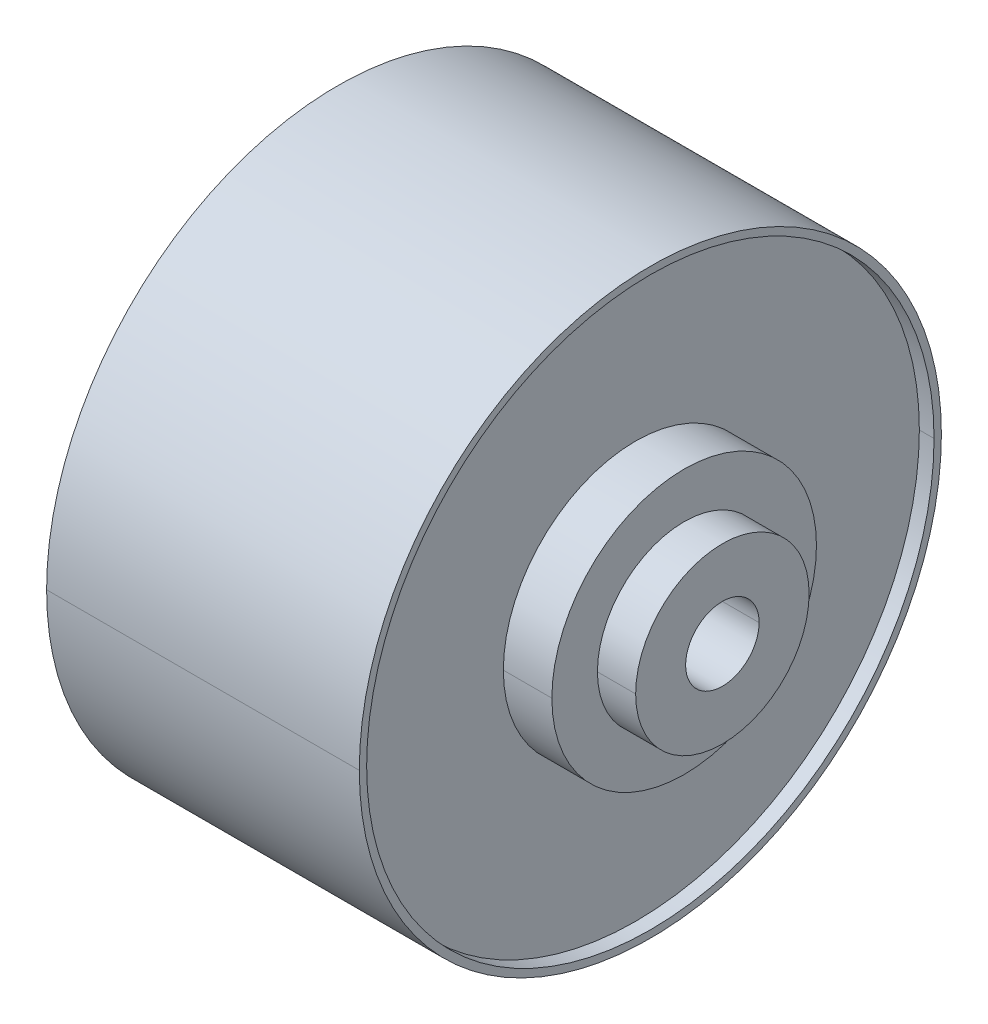
ISO-10303-21;
HEADER;
FILE_DESCRIPTION(('STEP AP214'),'2;1');
FILE_NAME('part.step','',(''),(''),'','','');
FILE_SCHEMA(('AUTOMOTIVE_DESIGN { 1 0 10303 214 1 1 1 1 }'));
ENDSEC;
DATA;
#1=APPLICATION_CONTEXT('core data for automotive mechanical design processes');
#2=APPLICATION_PROTOCOL_DEFINITION('international standard','automotive_design',2000,#1);
#3=PRODUCT_CONTEXT('',#1,'mechanical');
#4=PRODUCT('Part','Part','',(#3));
#5=PRODUCT_RELATED_PRODUCT_CATEGORY('part','',(#4));
#6=PRODUCT_DEFINITION_FORMATION('','',#4);
#7=PRODUCT_DEFINITION_CONTEXT('part definition',#1,'design');
#8=PRODUCT_DEFINITION('design','',#6,#7);
#9=PRODUCT_DEFINITION_SHAPE('','',#8);
#10=(LENGTH_UNIT() NAMED_UNIT(*) SI_UNIT(.MILLI.,.METRE.));
#11=(NAMED_UNIT(*) PLANE_ANGLE_UNIT() SI_UNIT($,.RADIAN.));
#12=(NAMED_UNIT(*) SI_UNIT($,.STERADIAN.) SOLID_ANGLE_UNIT());
#13=UNCERTAINTY_MEASURE_WITH_UNIT(LENGTH_MEASURE(1.E-05),#10,'distance_accuracy_value','');
#14=(GEOMETRIC_REPRESENTATION_CONTEXT(3) GLOBAL_UNCERTAINTY_ASSIGNED_CONTEXT((#13)) GLOBAL_UNIT_ASSIGNED_CONTEXT((#10,
#11,#12)) REPRESENTATION_CONTEXT('',''));
#15=CARTESIAN_POINT('',(0.,0.,0.));
#16=DIRECTION('',(0.,0.,1.));
#17=DIRECTION('',(1.,0.,0.));
#18=AXIS2_PLACEMENT_3D('',#15,#16,#17);
#19=CARTESIAN_POINT('',(2.5,5.9,0.));
#20=DIRECTION('',(-1.,0.,0.));
#21=DIRECTION('',(0.,0.,1.));
#22=AXIS2_PLACEMENT_3D('',#19,#20,#21);
#23=PLANE('',#22);
#24=CARTESIAN_POINT('',(2.5,1.04744440165294E-13,10.));
#25=DIRECTION('',(-1.,0.,0.));
#26=DIRECTION('',(0.,0.,1.));
#27=AXIS2_PLACEMENT_3D('',#24,#25,#26);
#28=CIRCLE('',#27,1.25);
#29=CARTESIAN_POINT('',(2.5,1.04744440165294E-13,11.25));
#30=VERTEX_POINT('',#29);
#31=CARTESIAN_POINT('',(2.5,1.04897521015187E-13,8.75));
#32=VERTEX_POINT('',#31);
#33=EDGE_CURVE('E258',#30,#32,#28,.T.);
#34=ORIENTED_EDGE('',*,*,#33,.T.);
#35=CARTESIAN_POINT('',(2.5,1.04744440165294E-13,10.));
#36=DIRECTION('',(-1.,0.,0.));
#37=DIRECTION('',(0.,0.,1.));
#38=AXIS2_PLACEMENT_3D('',#35,#36,#37);
#39=CIRCLE('',#38,1.25);
#40=EDGE_CURVE('E264',#32,#30,#39,.T.);
#41=ORIENTED_EDGE('',*,*,#40,.T.);
#42=EDGE_LOOP('',(#34,#41));
#43=FACE_BOUND('',#42,.T.);
#44=ADVANCED_FACE('F16',(#43),#23,.T.);
#45=CARTESIAN_POINT('',(0.,0.,0.));
#46=DIRECTION('',(1.,0.,0.));
#47=DIRECTION('',(0.,0.,-1.));
#48=AXIS2_PLACEMENT_3D('',#45,#46,#47);
#49=CYLINDRICAL_SURFACE('',#48,2.5);
#50=DIRECTION('',(1.,0.,0.));
#51=VECTOR('',#50,1.);
#52=CARTESIAN_POINT('',(0.,0.,2.5));
#53=LINE('',#52,#51);
#54=CARTESIAN_POINT('',(21.4,0.,2.5));
#55=VERTEX_POINT('',#54);
#56=CARTESIAN_POINT('',(26.9,0.,2.5));
#57=VERTEX_POINT('',#56);
#58=EDGE_CURVE('E246',#55,#57,#53,.T.);
#59=ORIENTED_EDGE('',*,*,#58,.F.);
#60=CARTESIAN_POINT('',(21.4,0.,0.));
#61=DIRECTION('',(1.,0.,0.));
#62=DIRECTION('',(0.,0.,-1.));
#63=AXIS2_PLACEMENT_3D('',#60,#61,#62);
#64=CIRCLE('',#63,2.5);
#65=CARTESIAN_POINT('',(21.4,0.,-2.5));
#66=VERTEX_POINT('',#65);
#67=EDGE_CURVE('E336',#66,#55,#64,.T.);
#68=ORIENTED_EDGE('',*,*,#67,.F.);
#69=DIRECTION('',(1.,0.,0.));
#70=VECTOR('',#69,1.);
#71=CARTESIAN_POINT('',(0.,0.,-2.5));
#72=LINE('',#71,#70);
#73=CARTESIAN_POINT('',(26.9,0.,-2.5));
#74=VERTEX_POINT('',#73);
#75=EDGE_CURVE('E270',#66,#74,#72,.T.);
#76=ORIENTED_EDGE('',*,*,#75,.T.);
#77=CARTESIAN_POINT('',(26.9,0.,0.));
#78=DIRECTION('',(1.,0.,0.));
#79=DIRECTION('',(0.,0.,-1.));
#80=AXIS2_PLACEMENT_3D('',#77,#78,#79);
#81=CIRCLE('',#80,2.5);
#82=EDGE_CURVE('E11',#74,#57,#81,.T.);
#83=ORIENTED_EDGE('',*,*,#82,.T.);
#84=EDGE_LOOP('',(#59,#68,#76,#83));
#85=FACE_BOUND('',#84,.T.);
#86=ADVANCED_FACE('F500',(#85),#49,.F.);
#87=CARTESIAN_POINT('',(26.9,2.5,0.));
#88=DIRECTION('',(1.,0.,0.));
#89=DIRECTION('',(0.,1.,0.));
#90=AXIS2_PLACEMENT_3D('',#87,#88,#89);
#91=PLANE('',#90);
#92=ORIENTED_EDGE('',*,*,#82,.F.);
#93=CARTESIAN_POINT('',(26.9,0.,0.));
#94=DIRECTION('',(1.,0.,0.));
#95=DIRECTION('',(0.,0.,-1.));
#96=AXIS2_PLACEMENT_3D('',#93,#94,#95);
#97=CIRCLE('',#96,2.5);
#98=EDGE_CURVE('E250',#57,#74,#97,.T.);
#99=ORIENTED_EDGE('',*,*,#98,.F.);
#100=EDGE_LOOP('',(#92,#99));
#101=FACE_BOUND('',#100,.T.);
#102=CARTESIAN_POINT('',(26.9,0.,0.));
#103=DIRECTION('',(1.,0.,0.));
#104=DIRECTION('',(0.,0.,-1.));
#105=AXIS2_PLACEMENT_3D('',#102,#103,#104);
#106=CIRCLE('',#105,5.9);
#107=CARTESIAN_POINT('',(26.9,0.,5.9));
#108=VERTEX_POINT('',#107);
#109=CARTESIAN_POINT('',(26.9,0.,-5.9));
#110=VERTEX_POINT('',#109);
#111=EDGE_CURVE('E27',#108,#110,#106,.T.);
#112=ORIENTED_EDGE('',*,*,#111,.T.);
#113=CARTESIAN_POINT('',(26.9,0.,0.));
#114=DIRECTION('',(1.,0.,0.));
#115=DIRECTION('',(0.,0.,-1.));
#116=AXIS2_PLACEMENT_3D('',#113,#114,#115);
#117=CIRCLE('',#116,5.9);
#118=EDGE_CURVE('E265',#110,#108,#117,.T.);
#119=ORIENTED_EDGE('',*,*,#118,.T.);
#120=EDGE_LOOP('',(#112,#119));
#121=FACE_BOUND('',#120,.T.);
#122=ADVANCED_FACE('F505',(#101,#121),#91,.T.);
#123=CARTESIAN_POINT('',(-70.3323251128322,0.,0.));
#124=DIRECTION('',(-1.,0.,0.));
#125=DIRECTION('',(0.,0.,1.));
#126=AXIS2_PLACEMENT_3D('',#123,#124,#125);
#127=CYLINDRICAL_SURFACE('',#126,5.9);
#128=DIRECTION('',(-1.,0.,0.));
#129=VECTOR('',#128,1.);
#130=CARTESIAN_POINT('',(-70.3323251128322,0.,-5.9));
#131=LINE('',#130,#129);
#132=CARTESIAN_POINT('',(24.3,0.,-5.9));
#133=VERTEX_POINT('',#132);
#134=EDGE_CURVE('E269',#110,#133,#131,.T.);
#135=ORIENTED_EDGE('',*,*,#134,.F.);
#136=ORIENTED_EDGE('',*,*,#111,.F.);
#137=DIRECTION('',(-1.,0.,0.));
#138=VECTOR('',#137,1.);
#139=CARTESIAN_POINT('',(-70.3323251128322,0.,5.9));
#140=LINE('',#139,#138);
#141=CARTESIAN_POINT('',(24.3,0.,5.9));
#142=VERTEX_POINT('',#141);
#143=EDGE_CURVE('E325',#108,#142,#140,.T.);
#144=ORIENTED_EDGE('',*,*,#143,.T.);
#145=CARTESIAN_POINT('',(24.3,0.,0.));
#146=DIRECTION('',(1.,0.,0.));
#147=DIRECTION('',(0.,0.,-1.));
#148=AXIS2_PLACEMENT_3D('',#145,#146,#147);
#149=CIRCLE('',#148,5.9);
#150=EDGE_CURVE('E280',#142,#133,#149,.T.);
#151=ORIENTED_EDGE('',*,*,#150,.T.);
#152=EDGE_LOOP('',(#135,#136,#144,#151));
#153=FACE_BOUND('',#152,.T.);
#154=ADVANCED_FACE('F509',(#153),#127,.T.);
#155=CARTESIAN_POINT('',(2.5,5.9,0.));
#156=DIRECTION('',(-1.,0.,0.));
#157=DIRECTION('',(0.,0.,1.));
#158=AXIS2_PLACEMENT_3D('',#155,#156,#157);
#159=PLANE('',#158);
#160=CARTESIAN_POINT('',(2.5,10.,0.));
#161=DIRECTION('',(-1.,0.,0.));
#162=DIRECTION('',(0.,0.,1.));
#163=AXIS2_PLACEMENT_3D('',#160,#161,#162);
#164=CIRCLE('',#163,1.25);
#165=CARTESIAN_POINT('',(2.5,10.,1.25));
#166=VERTEX_POINT('',#165);
#167=CARTESIAN_POINT('',(2.5,10.,-1.25));
#168=VERTEX_POINT('',#167);
#169=EDGE_CURVE('E335',#166,#168,#164,.T.);
#170=ORIENTED_EDGE('',*,*,#169,.T.);
#171=CARTESIAN_POINT('',(2.5,10.,0.));
#172=DIRECTION('',(-1.,0.,0.));
#173=DIRECTION('',(0.,0.,1.));
#174=AXIS2_PLACEMENT_3D('',#171,#172,#173);
#175=CIRCLE('',#174,1.25);
#176=EDGE_CURVE('E350',#168,#166,#175,.T.);
#177=ORIENTED_EDGE('',*,*,#176,.T.);
#178=EDGE_LOOP('',(#170,#177));
#179=FACE_BOUND('',#178,.T.);
#180=ADVANCED_FACE('F607',(#179),#159,.T.);
#181=CARTESIAN_POINT('',(2.5,5.9,0.));
#182=DIRECTION('',(-1.,0.,0.));
#183=DIRECTION('',(0.,0.,1.));
#184=AXIS2_PLACEMENT_3D('',#181,#182,#183);
#185=PLANE('',#184);
#186=CARTESIAN_POINT('',(2.5,0.,-10.));
#187=DIRECTION('',(-1.,0.,0.));
#188=DIRECTION('',(0.,0.,1.));
#189=AXIS2_PLACEMENT_3D('',#186,#187,#188);
#190=CIRCLE('',#189,1.25);
#191=CARTESIAN_POINT('',(2.5,0.,-8.75));
#192=VERTEX_POINT('',#191);
#193=CARTESIAN_POINT('',(2.5,0.,-11.25));
#194=VERTEX_POINT('',#193);
#195=EDGE_CURVE('E349',#192,#194,#190,.T.);
#196=ORIENTED_EDGE('',*,*,#195,.T.);
#197=CARTESIAN_POINT('',(2.5,0.,-10.));
#198=DIRECTION('',(-1.,0.,0.));
#199=DIRECTION('',(0.,0.,1.));
#200=AXIS2_PLACEMENT_3D('',#197,#198,#199);
#201=CIRCLE('',#200,1.25);
#202=EDGE_CURVE('E375',#194,#192,#201,.T.);
#203=ORIENTED_EDGE('',*,*,#202,.T.);
#204=EDGE_LOOP('',(#196,#203));
#205=FACE_BOUND('',#204,.T.);
#206=ADVANCED_FACE('F590',(#205),#185,.T.);
#207=CARTESIAN_POINT('',(2.5,5.9,0.));
#208=DIRECTION('',(-1.,0.,0.));
#209=DIRECTION('',(0.,0.,1.));
#210=AXIS2_PLACEMENT_3D('',#207,#208,#209);
#211=PLANE('',#210);
#212=CARTESIAN_POINT('',(2.5,-10.,0.));
#213=DIRECTION('',(-1.,0.,0.));
#214=DIRECTION('',(0.,0.,1.));
#215=AXIS2_PLACEMENT_3D('',#212,#213,#214);
#216=CIRCLE('',#215,1.25);
#217=CARTESIAN_POINT('',(2.5,-10.,1.25));
#218=VERTEX_POINT('',#217);
#219=CARTESIAN_POINT('',(2.5,-10.,-1.25));
#220=VERTEX_POINT('',#219);
#221=EDGE_CURVE('E287',#218,#220,#216,.T.);
#222=ORIENTED_EDGE('',*,*,#221,.T.);
#223=CARTESIAN_POINT('',(2.5,-10.,0.));
#224=DIRECTION('',(-1.,0.,0.));
#225=DIRECTION('',(0.,0.,1.));
#226=AXIS2_PLACEMENT_3D('',#223,#224,#225);
#227=CIRCLE('',#226,1.25);
#228=EDGE_CURVE('E362',#220,#218,#227,.T.);
#229=ORIENTED_EDGE('',*,*,#228,.T.);
#230=EDGE_LOOP('',(#222,#229));
#231=FACE_BOUND('',#230,.T.);
#232=ADVANCED_FACE('F586',(#231),#211,.T.);
#233=CARTESIAN_POINT('',(0.,1.04744440165294E-13,10.));
#234=DIRECTION('',(-1.,0.,0.));
#235=DIRECTION('',(0.,0.,1.));
#236=AXIS2_PLACEMENT_3D('',#233,#234,#235);
#237=CYLINDRICAL_SURFACE('',#236,1.25);
#238=DIRECTION('',(-1.,0.,0.));
#239=VECTOR('',#238,1.);
#240=CARTESIAN_POINT('',(0.,1.04897521015187E-13,8.75));
#241=LINE('',#240,#239);
#242=CARTESIAN_POINT('',(0.,1.04897521015187E-13,8.75));
#243=VERTEX_POINT('',#242);
#244=EDGE_CURVE('E259',#32,#243,#241,.T.);
#245=ORIENTED_EDGE('',*,*,#244,.F.);
#246=ORIENTED_EDGE('',*,*,#33,.F.);
#247=DIRECTION('',(-1.,0.,0.));
#248=VECTOR('',#247,1.);
#249=CARTESIAN_POINT('',(0.,1.04744440165294E-13,11.25));
#250=LINE('',#249,#248);
#251=CARTESIAN_POINT('',(0.,1.04744440165294E-13,11.25));
#252=VERTEX_POINT('',#251);
#253=EDGE_CURVE('E366',#30,#252,#250,.T.);
#254=ORIENTED_EDGE('',*,*,#253,.T.);
#255=CARTESIAN_POINT('',(0.,1.04744440165294E-13,10.));
#256=DIRECTION('',(-1.,0.,0.));
#257=DIRECTION('',(0.,0.,1.));
#258=AXIS2_PLACEMENT_3D('',#255,#256,#257);
#259=CIRCLE('',#258,1.24999999999999);
#260=EDGE_CURVE('E295',#252,#243,#259,.T.);
#261=ORIENTED_EDGE('',*,*,#260,.T.);
#262=EDGE_LOOP('',(#245,#246,#254,#261));
#263=FACE_BOUND('',#262,.T.);
#264=ADVANCED_FACE('F467',(#263),#237,.F.);
#265=CARTESIAN_POINT('',(0.,19.8,0.));
#266=DIRECTION('',(1.,0.,0.));
#267=DIRECTION('',(0.,1.,0.));
#268=AXIS2_PLACEMENT_3D('',#265,#266,#267);
#269=PLANE('',#268);
#270=CARTESIAN_POINT('',(0.,10.,0.));
#271=DIRECTION('',(-1.,0.,0.));
#272=DIRECTION('',(0.,0.,1.));
#273=AXIS2_PLACEMENT_3D('',#270,#271,#272);
#274=CIRCLE('',#273,1.24999999999999);
#275=CARTESIAN_POINT('',(0.,10.,1.24999999999999));
#276=VERTEX_POINT('',#275);
#277=CARTESIAN_POINT('',(0.,10.,-1.24999999999999));
#278=VERTEX_POINT('',#277);
#279=EDGE_CURVE('E346',#276,#278,#274,.T.);
#280=ORIENTED_EDGE('',*,*,#279,.F.);
#281=CARTESIAN_POINT('',(0.,10.,0.));
#282=DIRECTION('',(-1.,0.,0.));
#283=DIRECTION('',(0.,0.,1.));
#284=AXIS2_PLACEMENT_3D('',#281,#282,#283);
#285=CIRCLE('',#284,1.24999999999999);
#286=EDGE_CURVE('E382',#278,#276,#285,.T.);
#287=ORIENTED_EDGE('',*,*,#286,.F.);
#288=EDGE_LOOP('',(#280,#287));
#289=FACE_BOUND('',#288,.T.);
#290=CARTESIAN_POINT('',(0.,0.,-10.));
#291=DIRECTION('',(-1.,0.,0.));
#292=DIRECTION('',(0.,0.,1.));
#293=AXIS2_PLACEMENT_3D('',#290,#291,#292);
#294=CIRCLE('',#293,1.24999999999999);
#295=CARTESIAN_POINT('',(0.,0.,-8.75));
#296=VERTEX_POINT('',#295);
#297=CARTESIAN_POINT('',(0.,0.,-11.25));
#298=VERTEX_POINT('',#297);
#299=EDGE_CURVE('E292',#296,#298,#294,.T.);
#300=ORIENTED_EDGE('',*,*,#299,.F.);
#301=CARTESIAN_POINT('',(0.,0.,-10.));
#302=DIRECTION('',(-1.,0.,0.));
#303=DIRECTION('',(0.,0.,1.));
#304=AXIS2_PLACEMENT_3D('',#301,#302,#303);
#305=CIRCLE('',#304,1.24999999999999);
#306=EDGE_CURVE('E374',#298,#296,#305,.T.);
#307=ORIENTED_EDGE('',*,*,#306,.F.);
#308=EDGE_LOOP('',(#300,#307));
#309=FACE_BOUND('',#308,.T.);
#310=CARTESIAN_POINT('',(0.,-10.,0.));
#311=DIRECTION('',(-1.,0.,0.));
#312=DIRECTION('',(0.,0.,1.));
#313=AXIS2_PLACEMENT_3D('',#310,#311,#312);
#314=CIRCLE('',#313,1.24999999999999);
#315=CARTESIAN_POINT('',(0.,-10.,1.24999999999999));
#316=VERTEX_POINT('',#315);
#317=CARTESIAN_POINT('',(0.,-10.,-1.24999999999999));
#318=VERTEX_POINT('',#317);
#319=EDGE_CURVE('E291',#316,#318,#314,.T.);
#320=ORIENTED_EDGE('',*,*,#319,.F.);
#321=CARTESIAN_POINT('',(0.,-10.,0.));
#322=DIRECTION('',(-1.,0.,0.));
#323=DIRECTION('',(0.,0.,1.));
#324=AXIS2_PLACEMENT_3D('',#321,#322,#323);
#325=CIRCLE('',#324,1.24999999999999);
#326=EDGE_CURVE('E274',#318,#316,#325,.T.);
#327=ORIENTED_EDGE('',*,*,#326,.F.);
#328=EDGE_LOOP('',(#320,#327));
#329=FACE_BOUND('',#328,.T.);
#330=ORIENTED_EDGE('',*,*,#260,.F.);
#331=CARTESIAN_POINT('',(0.,1.04744440165294E-13,10.));
#332=DIRECTION('',(-1.,0.,0.));
#333=DIRECTION('',(0.,0.,1.));
#334=AXIS2_PLACEMENT_3D('',#331,#332,#333);
#335=CIRCLE('',#334,1.24999999999999);
#336=EDGE_CURVE('E263',#243,#252,#335,.T.);
#337=ORIENTED_EDGE('',*,*,#336,.F.);
#338=EDGE_LOOP('',(#330,#337));
#339=FACE_BOUND('',#338,.T.);
#340=CARTESIAN_POINT('',(0.,0.,0.));
#341=DIRECTION('',(1.,0.,0.));
#342=DIRECTION('',(0.,0.,-1.));
#343=AXIS2_PLACEMENT_3D('',#340,#341,#342);
#344=CIRCLE('',#343,4.55);
#345=CARTESIAN_POINT('',(0.,0.,4.55));
#346=VERTEX_POINT('',#345);
#347=CARTESIAN_POINT('',(0.,0.,-4.55));
#348=VERTEX_POINT('',#347);
#349=EDGE_CURVE('E317',#346,#348,#344,.T.);
#350=ORIENTED_EDGE('',*,*,#349,.T.);
#351=CARTESIAN_POINT('',(0.,0.,0.));
#352=DIRECTION('',(1.,0.,0.));
#353=DIRECTION('',(0.,0.,-1.));
#354=AXIS2_PLACEMENT_3D('',#351,#352,#353);
#355=CIRCLE('',#354,4.55);
#356=EDGE_CURVE('E332',#348,#346,#355,.T.);
#357=ORIENTED_EDGE('',*,*,#356,.T.);
#358=EDGE_LOOP('',(#350,#357));
#359=FACE_BOUND('',#358,.T.);
#360=CARTESIAN_POINT('',(0.,0.,0.));
#361=DIRECTION('',(-1.,0.,0.));
#362=DIRECTION('',(0.,0.,-1.));
#363=AXIS2_PLACEMENT_3D('',#360,#361,#362);
#364=CIRCLE('',#363,17.8);
#365=CARTESIAN_POINT('',(0.,0.,-17.8));
#366=VERTEX_POINT('',#365);
#367=CARTESIAN_POINT('',(0.,0.,17.8));
#368=VERTEX_POINT('',#367);
#369=EDGE_CURVE('E20',#366,#368,#364,.T.);
#370=ORIENTED_EDGE('',*,*,#369,.T.);
#371=CARTESIAN_POINT('',(0.,0.,0.));
#372=DIRECTION('',(-1.,0.,0.));
#373=DIRECTION('',(0.,0.,-1.));
#374=AXIS2_PLACEMENT_3D('',#371,#372,#373);
#375=CIRCLE('',#374,17.8);
#376=EDGE_CURVE('E337',#368,#366,#375,.T.);
#377=ORIENTED_EDGE('',*,*,#376,.T.);
#378=EDGE_LOOP('',(#370,#377));
#379=FACE_BOUND('',#378,.T.);
#380=ADVANCED_FACE('F463',(#289,#309,#329,#339,#359,#379),#269,.F.);
#381=CARTESIAN_POINT('',(0.,-10.,0.));
#382=DIRECTION('',(-1.,0.,0.));
#383=DIRECTION('',(0.,0.,1.));
#384=AXIS2_PLACEMENT_3D('',#381,#382,#383);
#385=CYLINDRICAL_SURFACE('',#384,1.25);
#386=DIRECTION('',(-1.,0.,0.));
#387=VECTOR('',#386,1.);
#388=CARTESIAN_POINT('',(0.,-10.,-1.25));
#389=LINE('',#388,#387);
#390=EDGE_CURVE('E279',#220,#318,#389,.T.);
#391=ORIENTED_EDGE('',*,*,#390,.F.);
#392=ORIENTED_EDGE('',*,*,#221,.F.);
#393=DIRECTION('',(-1.,0.,0.));
#394=VECTOR('',#393,1.);
#395=CARTESIAN_POINT('',(0.,-10.,1.25));
#396=LINE('',#395,#394);
#397=EDGE_CURVE('E278',#218,#316,#396,.T.);
#398=ORIENTED_EDGE('',*,*,#397,.T.);
#399=ORIENTED_EDGE('',*,*,#319,.T.);
#400=EDGE_LOOP('',(#391,#392,#398,#399));
#401=FACE_BOUND('',#400,.T.);
#402=ADVANCED_FACE('F466',(#401),#385,.F.);
#403=CARTESIAN_POINT('',(0.,0.,-10.));
#404=DIRECTION('',(-1.,0.,0.));
#405=DIRECTION('',(0.,0.,1.));
#406=AXIS2_PLACEMENT_3D('',#403,#404,#405);
#407=CYLINDRICAL_SURFACE('',#406,1.25);
#408=DIRECTION('',(-1.,0.,0.));
#409=VECTOR('',#408,1.);
#410=CARTESIAN_POINT('',(0.,0.,-11.25));
#411=LINE('',#410,#409);
#412=EDGE_CURVE('E370',#194,#298,#411,.T.);
#413=ORIENTED_EDGE('',*,*,#412,.F.);
#414=ORIENTED_EDGE('',*,*,#195,.F.);
#415=DIRECTION('',(-1.,0.,0.));
#416=VECTOR('',#415,1.);
#417=CARTESIAN_POINT('',(0.,0.,-8.75));
#418=LINE('',#417,#416);
#419=EDGE_CURVE('E355',#192,#296,#418,.T.);
#420=ORIENTED_EDGE('',*,*,#419,.T.);
#421=ORIENTED_EDGE('',*,*,#299,.T.);
#422=EDGE_LOOP('',(#413,#414,#420,#421));
#423=FACE_BOUND('',#422,.T.);
#424=ADVANCED_FACE('F457',(#423),#407,.F.);
#425=CARTESIAN_POINT('',(0.,10.,0.));
#426=DIRECTION('',(-1.,0.,0.));
#427=DIRECTION('',(0.,0.,1.));
#428=AXIS2_PLACEMENT_3D('',#425,#426,#427);
#429=CYLINDRICAL_SURFACE('',#428,1.25);
#430=DIRECTION('',(-1.,0.,0.));
#431=VECTOR('',#430,1.);
#432=CARTESIAN_POINT('',(0.,10.,-1.25));
#433=LINE('',#432,#431);
#434=EDGE_CURVE('E354',#168,#278,#433,.T.);
#435=ORIENTED_EDGE('',*,*,#434,.F.);
#436=ORIENTED_EDGE('',*,*,#169,.F.);
#437=DIRECTION('',(-1.,0.,0.));
#438=VECTOR('',#437,1.);
#439=CARTESIAN_POINT('',(0.,10.,1.25));
#440=LINE('',#439,#438);
#441=EDGE_CURVE('E303',#166,#276,#440,.T.);
#442=ORIENTED_EDGE('',*,*,#441,.T.);
#443=ORIENTED_EDGE('',*,*,#279,.T.);
#444=EDGE_LOOP('',(#435,#436,#442,#443));
#445=FACE_BOUND('',#444,.T.);
#446=ADVANCED_FACE('F521',(#445),#429,.F.);
#447=CARTESIAN_POINT('',(0.5,0.,0.));
#448=DIRECTION('',(-1.,0.,0.));
#449=DIRECTION('',(0.,0.,1.));
#450=AXIS2_PLACEMENT_3D('',#447,#448,#449);
#451=CONICAL_SURFACE('',#450,4.05,0.78539816339746);
#452=DIRECTION('',(-0.70710678118654,0.,-0.707106781186556));
#453=VECTOR('',#452,1.);
#454=CARTESIAN_POINT('',(0.5,0.,-4.05));
#455=LINE('',#454,#453);
#456=CARTESIAN_POINT('',(0.5,0.,-4.05));
#457=VERTEX_POINT('',#456);
#458=EDGE_CURVE('E302',#457,#348,#455,.T.);
#459=ORIENTED_EDGE('',*,*,#458,.F.);
#460=CARTESIAN_POINT('',(0.5,0.,0.));
#461=DIRECTION('',(-1.,0.,0.));
#462=DIRECTION('',(0.,0.,-1.));
#463=AXIS2_PLACEMENT_3D('',#460,#461,#462);
#464=CIRCLE('',#463,4.05);
#465=CARTESIAN_POINT('',(0.5,0.,4.05));
#466=VERTEX_POINT('',#465);
#467=EDGE_CURVE('E391',#466,#457,#464,.T.);
#468=ORIENTED_EDGE('',*,*,#467,.F.);
#469=DIRECTION('',(-0.70710678118654,0.,0.707106781186556));
#470=VECTOR('',#469,1.);
#471=CARTESIAN_POINT('',(0.5,0.,4.05));
#472=LINE('',#471,#470);
#473=EDGE_CURVE('E309',#466,#346,#472,.T.);
#474=ORIENTED_EDGE('',*,*,#473,.T.);
#475=ORIENTED_EDGE('',*,*,#356,.F.);
#476=EDGE_LOOP('',(#459,#468,#474,#475));
#477=FACE_BOUND('',#476,.T.);
#478=ADVANCED_FACE('F517',(#477),#451,.F.);
#479=CARTESIAN_POINT('',(21.4,4.05,0.));
#480=DIRECTION('',(1.,0.,0.));
#481=DIRECTION('',(0.,1.,0.));
#482=AXIS2_PLACEMENT_3D('',#479,#480,#481);
#483=PLANE('',#482);
#484=ORIENTED_EDGE('',*,*,#67,.T.);
#485=CARTESIAN_POINT('',(21.4,0.,0.));
#486=DIRECTION('',(1.,0.,0.));
#487=DIRECTION('',(0.,0.,-1.));
#488=AXIS2_PLACEMENT_3D('',#485,#486,#487);
#489=CIRCLE('',#488,2.5);
#490=EDGE_CURVE('E251',#55,#66,#489,.T.);
#491=ORIENTED_EDGE('',*,*,#490,.T.);
#492=EDGE_LOOP('',(#484,#491));
#493=FACE_BOUND('',#492,.T.);
#494=CARTESIAN_POINT('',(21.4,0.,0.));
#495=DIRECTION('',(-1.,0.,0.));
#496=DIRECTION('',(0.,0.,1.));
#497=AXIS2_PLACEMENT_3D('',#494,#495,#496);
#498=CIRCLE('',#497,4.05);
#499=CARTESIAN_POINT('',(21.4,0.,4.05));
#500=VERTEX_POINT('',#499);
#501=CARTESIAN_POINT('',(21.4,0.,-4.05));
#502=VERTEX_POINT('',#501);
#503=EDGE_CURVE('E394',#500,#502,#498,.T.);
#504=ORIENTED_EDGE('',*,*,#503,.T.);
#505=CARTESIAN_POINT('',(21.4,0.,0.));
#506=DIRECTION('',(-1.,0.,0.));
#507=DIRECTION('',(0.,0.,1.));
#508=AXIS2_PLACEMENT_3D('',#505,#506,#507);
#509=CIRCLE('',#508,4.05);
#510=EDGE_CURVE('E304',#502,#500,#509,.T.);
#511=ORIENTED_EDGE('',*,*,#510,.T.);
#512=EDGE_LOOP('',(#504,#511));
#513=FACE_BOUND('',#512,.T.);
#514=ADVANCED_FACE('F520',(#493,#513),#483,.F.);
#515=CARTESIAN_POINT('',(-70.3323251128322,0.,0.));
#516=DIRECTION('',(-1.,0.,0.));
#517=DIRECTION('',(0.,0.,1.));
#518=AXIS2_PLACEMENT_3D('',#515,#516,#517);
#519=CYLINDRICAL_SURFACE('',#518,4.05);
#520=DIRECTION('',(-1.,0.,0.));
#521=VECTOR('',#520,1.);
#522=CARTESIAN_POINT('',(-70.3323251128322,0.,-4.05));
#523=LINE('',#522,#521);
#524=EDGE_CURVE('E308',#502,#457,#523,.T.);
#525=ORIENTED_EDGE('',*,*,#524,.F.);
#526=ORIENTED_EDGE('',*,*,#503,.F.);
#527=DIRECTION('',(-1.,0.,0.));
#528=VECTOR('',#527,1.);
#529=CARTESIAN_POINT('',(-70.3323251128322,0.,4.05));
#530=LINE('',#529,#528);
#531=EDGE_CURVE('E331',#500,#466,#530,.T.);
#532=ORIENTED_EDGE('',*,*,#531,.T.);
#533=ORIENTED_EDGE('',*,*,#467,.T.);
#534=EDGE_LOOP('',(#525,#526,#532,#533));
#535=FACE_BOUND('',#534,.T.);
#536=ADVANCED_FACE('F525',(#535),#519,.F.);
#537=CARTESIAN_POINT('',(0.,0.,0.));
#538=DIRECTION('',(1.,0.,0.));
#539=DIRECTION('',(0.,0.,-1.));
#540=AXIS2_PLACEMENT_3D('',#537,#538,#539);
#541=CONICAL_SURFACE('',#540,17.8,1.22173047639603);
#542=DIRECTION('',(0.342020143325665,0.,0.93969262078591));
#543=VECTOR('',#542,1.);
#544=CARTESIAN_POINT('',(0.,0.,17.8));
#545=LINE('',#544,#543);
#546=CARTESIAN_POINT('',(0.727940468532404,0.,19.8));
#547=VERTEX_POINT('',#546);
#548=EDGE_CURVE('E341',#368,#547,#545,.T.);
#549=ORIENTED_EDGE('',*,*,#548,.F.);
#550=ORIENTED_EDGE('',*,*,#369,.F.);
#551=DIRECTION('',(0.342020143325665,0.,-0.93969262078591));
#552=VECTOR('',#551,1.);
#553=CARTESIAN_POINT('',(0.,0.,-17.8));
#554=LINE('',#553,#552);
#555=CARTESIAN_POINT('',(0.727940468532404,0.,-19.8));
#556=VERTEX_POINT('',#555);
#557=EDGE_CURVE('E233',#366,#556,#554,.T.);
#558=ORIENTED_EDGE('',*,*,#557,.T.);
#559=CARTESIAN_POINT('',(0.727940468532404,0.,0.));
#560=DIRECTION('',(1.,0.,0.));
#561=DIRECTION('',(0.,0.,-1.));
#562=AXIS2_PLACEMENT_3D('',#559,#560,#561);
#563=CIRCLE('',#562,19.8);
#564=EDGE_CURVE('E220',#547,#556,#563,.T.);
#565=ORIENTED_EDGE('',*,*,#564,.F.);
#566=EDGE_LOOP('',(#549,#550,#558,#565));
#567=FACE_BOUND('',#566,.T.);
#568=ADVANCED_FACE('F481',(#567),#541,.T.);
#569=CARTESIAN_POINT('',(-70.3323251128322,0.,0.));
#570=DIRECTION('',(-1.,0.,0.));
#571=DIRECTION('',(0.,0.,1.));
#572=AXIS2_PLACEMENT_3D('',#569,#570,#571);
#573=CYLINDRICAL_SURFACE('',#572,19.8);
#574=DIRECTION('',(-1.,0.,0.));
#575=VECTOR('',#574,1.);
#576=CARTESIAN_POINT('',(-70.3323251128322,0.,-19.8));
#577=LINE('',#576,#575);
#578=CARTESIAN_POINT('',(22.,0.,-19.8));
#579=VERTEX_POINT('',#578);
#580=EDGE_CURVE('E224',#579,#556,#577,.T.);
#581=ORIENTED_EDGE('',*,*,#580,.F.);
#582=CARTESIAN_POINT('',(22.,0.,0.));
#583=DIRECTION('',(1.,0.,0.));
#584=DIRECTION('',(0.,0.,-1.));
#585=AXIS2_PLACEMENT_3D('',#582,#583,#584);
#586=CIRCLE('',#585,19.8);
#587=CARTESIAN_POINT('',(22.,0.,19.8));
#588=VERTEX_POINT('',#587);
#589=EDGE_CURVE('E211',#588,#579,#586,.T.);
#590=ORIENTED_EDGE('',*,*,#589,.F.);
#591=DIRECTION('',(-1.,0.,0.));
#592=VECTOR('',#591,1.);
#593=CARTESIAN_POINT('',(-70.3323251128322,0.,19.8));
#594=LINE('',#593,#592);
#595=EDGE_CURVE('E230',#588,#547,#594,.T.);
#596=ORIENTED_EDGE('',*,*,#595,.T.);
#597=ORIENTED_EDGE('',*,*,#564,.T.);
#598=EDGE_LOOP('',(#581,#590,#596,#597));
#599=FACE_BOUND('',#598,.T.);
#600=ADVANCED_FACE('F225',(#599),#573,.T.);
#601=CARTESIAN_POINT('',(22.,19.3,0.));
#602=DIRECTION('',(1.,0.,0.));
#603=DIRECTION('',(0.,1.,0.));
#604=AXIS2_PLACEMENT_3D('',#601,#602,#603);
#605=PLANE('',#604);
#606=CARTESIAN_POINT('',(22.,0.,0.));
#607=DIRECTION('',(1.,0.,0.));
#608=DIRECTION('',(0.,0.,-1.));
#609=AXIS2_PLACEMENT_3D('',#606,#607,#608);
#610=CIRCLE('',#609,19.3);
#611=CARTESIAN_POINT('',(22.,0.,-19.3));
#612=VERTEX_POINT('',#611);
#613=CARTESIAN_POINT('',(22.,0.,19.3));
#614=VERTEX_POINT('',#613);
#615=EDGE_CURVE('E221',#612,#614,#610,.T.);
#616=ORIENTED_EDGE('',*,*,#615,.F.);
#617=CARTESIAN_POINT('',(22.,0.,0.));
#618=DIRECTION('',(1.,0.,0.));
#619=DIRECTION('',(0.,0.,-1.));
#620=AXIS2_PLACEMENT_3D('',#617,#618,#619);
#621=CIRCLE('',#620,19.3);
#622=EDGE_CURVE('E243',#614,#612,#621,.T.);
#623=ORIENTED_EDGE('',*,*,#622,.F.);
#624=EDGE_LOOP('',(#616,#623));
#625=FACE_BOUND('',#624,.T.);
#626=ORIENTED_EDGE('',*,*,#589,.T.);
#627=CARTESIAN_POINT('',(22.,0.,0.));
#628=DIRECTION('',(1.,0.,0.));
#629=DIRECTION('',(0.,0.,-1.));
#630=AXIS2_PLACEMENT_3D('',#627,#628,#629);
#631=CIRCLE('',#630,19.8);
#632=EDGE_CURVE('E215',#579,#588,#631,.T.);
#633=ORIENTED_EDGE('',*,*,#632,.T.);
#634=EDGE_LOOP('',(#626,#633));
#635=FACE_BOUND('',#634,.T.);
#636=ADVANCED_FACE('F213',(#625,#635),#605,.T.);
#637=CARTESIAN_POINT('',(0.,0.,0.));
#638=DIRECTION('',(1.,0.,0.));
#639=DIRECTION('',(0.,0.,-1.));
#640=AXIS2_PLACEMENT_3D('',#637,#638,#639);
#641=CYLINDRICAL_SURFACE('',#640,19.3);
#642=DIRECTION('',(1.,0.,0.));
#643=VECTOR('',#642,1.);
#644=CARTESIAN_POINT('',(0.,0.,19.3));
#645=LINE('',#644,#643);
#646=CARTESIAN_POINT('',(21.,0.,19.3));
#647=VERTEX_POINT('',#646);
#648=EDGE_CURVE('E345',#647,#614,#645,.T.);
#649=ORIENTED_EDGE('',*,*,#648,.F.);
#650=CARTESIAN_POINT('',(21.,0.,0.));
#651=DIRECTION('',(1.,0.,0.));
#652=DIRECTION('',(0.,0.,-1.));
#653=AXIS2_PLACEMENT_3D('',#650,#651,#652);
#654=CIRCLE('',#653,19.3);
#655=CARTESIAN_POINT('',(21.,0.,-19.3));
#656=VERTEX_POINT('',#655);
#657=EDGE_CURVE('E316',#656,#647,#654,.T.);
#658=ORIENTED_EDGE('',*,*,#657,.F.);
#659=DIRECTION('',(1.,0.,0.));
#660=VECTOR('',#659,1.);
#661=CARTESIAN_POINT('',(0.,0.,-19.3));
#662=LINE('',#661,#660);
#663=EDGE_CURVE('E359',#656,#612,#662,.T.);
#664=ORIENTED_EDGE('',*,*,#663,.T.);
#665=ORIENTED_EDGE('',*,*,#615,.T.);
#666=EDGE_LOOP('',(#649,#658,#664,#665));
#667=FACE_BOUND('',#666,.T.);
#668=ADVANCED_FACE('F564',(#667),#641,.F.);
#669=CARTESIAN_POINT('',(21.,19.3,0.));
#670=DIRECTION('',(1.,0.,0.));
#671=DIRECTION('',(0.,1.,0.));
#672=AXIS2_PLACEMENT_3D('',#669,#670,#671);
#673=PLANE('',#672);
#674=CARTESIAN_POINT('',(21.,0.,0.));
#675=DIRECTION('',(1.,0.,0.));
#676=DIRECTION('',(0.,0.,-1.));
#677=AXIS2_PLACEMENT_3D('',#674,#675,#676);
#678=CIRCLE('',#677,9.);
#679=CARTESIAN_POINT('',(21.,0.,-9.));
#680=VERTEX_POINT('',#679);
#681=CARTESIAN_POINT('',(21.,0.,9.));
#682=VERTEX_POINT('',#681);
#683=EDGE_CURVE('E313',#680,#682,#678,.T.);
#684=ORIENTED_EDGE('',*,*,#683,.F.);
#685=CARTESIAN_POINT('',(21.,0.,0.));
#686=DIRECTION('',(1.,0.,0.));
#687=DIRECTION('',(0.,0.,-1.));
#688=AXIS2_PLACEMENT_3D('',#685,#686,#687);
#689=CIRCLE('',#688,9.);
#690=EDGE_CURVE('E283',#682,#680,#689,.T.);
#691=ORIENTED_EDGE('',*,*,#690,.F.);
#692=EDGE_LOOP('',(#684,#691));
#693=FACE_BOUND('',#692,.T.);
#694=ORIENTED_EDGE('',*,*,#657,.T.);
#695=CARTESIAN_POINT('',(21.,0.,0.));
#696=DIRECTION('',(1.,0.,0.));
#697=DIRECTION('',(0.,0.,-1.));
#698=AXIS2_PLACEMENT_3D('',#695,#696,#697);
#699=CIRCLE('',#698,19.3);
#700=EDGE_CURVE('E272',#647,#656,#699,.T.);
#701=ORIENTED_EDGE('',*,*,#700,.T.);
#702=EDGE_LOOP('',(#694,#701));
#703=FACE_BOUND('',#702,.T.);
#704=ADVANCED_FACE('F18',(#693,#703),#673,.T.);
#705=CARTESIAN_POINT('',(0.,0.,0.));
#706=DIRECTION('',(1.,0.,0.));
#707=DIRECTION('',(0.,0.,-1.));
#708=AXIS2_PLACEMENT_3D('',#705,#706,#707);
#709=CYLINDRICAL_SURFACE('',#708,9.);
#710=DIRECTION('',(1.,0.,0.));
#711=VECTOR('',#710,1.);
#712=CARTESIAN_POINT('',(0.,0.,9.));
#713=LINE('',#712,#711);
#714=CARTESIAN_POINT('',(24.3,0.,9.));
#715=VERTEX_POINT('',#714);
#716=EDGE_CURVE('E294',#682,#715,#713,.T.);
#717=ORIENTED_EDGE('',*,*,#716,.F.);
#718=ORIENTED_EDGE('',*,*,#690,.T.);
#719=DIRECTION('',(1.,0.,0.));
#720=VECTOR('',#719,1.);
#721=CARTESIAN_POINT('',(0.,0.,-9.));
#722=LINE('',#721,#720);
#723=CARTESIAN_POINT('',(24.3,0.,-9.));
#724=VERTEX_POINT('',#723);
#725=EDGE_CURVE('E252',#680,#724,#722,.T.);
#726=ORIENTED_EDGE('',*,*,#725,.T.);
#727=CARTESIAN_POINT('',(24.3,0.,0.));
#728=DIRECTION('',(1.,0.,0.));
#729=DIRECTION('',(0.,0.,-1.));
#730=AXIS2_PLACEMENT_3D('',#727,#728,#729);
#731=CIRCLE('',#730,9.);
#732=EDGE_CURVE('E41',#715,#724,#731,.T.);
#733=ORIENTED_EDGE('',*,*,#732,.F.);
#734=EDGE_LOOP('',(#717,#718,#726,#733));
#735=FACE_BOUND('',#734,.T.);
#736=ADVANCED_FACE('F526',(#735),#709,.T.);
#737=CARTESIAN_POINT('',(24.3,5.9,0.));
#738=DIRECTION('',(1.,0.,0.));
#739=DIRECTION('',(0.,1.,0.));
#740=AXIS2_PLACEMENT_3D('',#737,#738,#739);
#741=PLANE('',#740);
#742=ORIENTED_EDGE('',*,*,#150,.F.);
#743=CARTESIAN_POINT('',(24.3,0.,0.));
#744=DIRECTION('',(1.,0.,0.));
#745=DIRECTION('',(0.,0.,-1.));
#746=AXIS2_PLACEMENT_3D('',#743,#744,#745);
#747=CIRCLE('',#746,5.9);
#748=EDGE_CURVE('E321',#133,#142,#747,.T.);
#749=ORIENTED_EDGE('',*,*,#748,.F.);
#750=EDGE_LOOP('',(#742,#749));
#751=FACE_BOUND('',#750,.T.);
#752=CARTESIAN_POINT('',(24.3,0.,0.));
#753=DIRECTION('',(1.,0.,0.));
#754=DIRECTION('',(0.,0.,-1.));
#755=AXIS2_PLACEMENT_3D('',#752,#753,#754);
#756=CIRCLE('',#755,9.);
#757=EDGE_CURVE('E255',#724,#715,#756,.T.);
#758=ORIENTED_EDGE('',*,*,#757,.T.);
#759=ORIENTED_EDGE('',*,*,#732,.T.);
#760=EDGE_LOOP('',(#758,#759));
#761=FACE_BOUND('',#760,.T.);
#762=ADVANCED_FACE('F529',(#751,#761),#741,.T.);
#763=CARTESIAN_POINT('',(0.,0.,0.));
#764=DIRECTION('',(1.,0.,0.));
#765=DIRECTION('',(0.,0.,-1.));
#766=AXIS2_PLACEMENT_3D('',#763,#764,#765);
#767=CYLINDRICAL_SURFACE('',#766,9.);
#768=ORIENTED_EDGE('',*,*,#683,.T.);
#769=ORIENTED_EDGE('',*,*,#716,.T.);
#770=ORIENTED_EDGE('',*,*,#757,.F.);
#771=ORIENTED_EDGE('',*,*,#725,.F.);
#772=EDGE_LOOP('',(#768,#769,#770,#771));
#773=FACE_BOUND('',#772,.T.);
#774=ADVANCED_FACE('F554',(#773),#767,.T.);
#775=CARTESIAN_POINT('',(0.,0.,0.));
#776=DIRECTION('',(1.,0.,0.));
#777=DIRECTION('',(0.,0.,-1.));
#778=AXIS2_PLACEMENT_3D('',#775,#776,#777);
#779=CYLINDRICAL_SURFACE('',#778,19.3);
#780=ORIENTED_EDGE('',*,*,#700,.F.);
#781=ORIENTED_EDGE('',*,*,#648,.T.);
#782=ORIENTED_EDGE('',*,*,#622,.T.);
#783=ORIENTED_EDGE('',*,*,#663,.F.);
#784=EDGE_LOOP('',(#780,#781,#782,#783));
#785=FACE_BOUND('',#784,.T.);
#786=ADVANCED_FACE('F495',(#785),#779,.F.);
#787=CARTESIAN_POINT('',(-70.3323251128322,0.,0.));
#788=DIRECTION('',(-1.,0.,0.));
#789=DIRECTION('',(0.,0.,1.));
#790=AXIS2_PLACEMENT_3D('',#787,#788,#789);
#791=CYLINDRICAL_SURFACE('',#790,19.8);
#792=ORIENTED_EDGE('',*,*,#632,.F.);
#793=ORIENTED_EDGE('',*,*,#580,.T.);
#794=CARTESIAN_POINT('',(0.727940468532404,0.,0.));
#795=DIRECTION('',(1.,0.,0.));
#796=DIRECTION('',(0.,0.,-1.));
#797=AXIS2_PLACEMENT_3D('',#794,#795,#796);
#798=CIRCLE('',#797,19.8);
#799=EDGE_CURVE('E240',#556,#547,#798,.T.);
#800=ORIENTED_EDGE('',*,*,#799,.T.);
#801=ORIENTED_EDGE('',*,*,#595,.F.);
#802=EDGE_LOOP('',(#792,#793,#800,#801));
#803=FACE_BOUND('',#802,.T.);
#804=ADVANCED_FACE('F231',(#803),#791,.T.);
#805=CARTESIAN_POINT('',(0.,0.,0.));
#806=DIRECTION('',(1.,0.,0.));
#807=DIRECTION('',(0.,0.,-1.));
#808=AXIS2_PLACEMENT_3D('',#805,#806,#807);
#809=CONICAL_SURFACE('',#808,17.8,1.22173047639603);
#810=ORIENTED_EDGE('',*,*,#376,.F.);
#811=ORIENTED_EDGE('',*,*,#548,.T.);
#812=ORIENTED_EDGE('',*,*,#799,.F.);
#813=ORIENTED_EDGE('',*,*,#557,.F.);
#814=EDGE_LOOP('',(#810,#811,#812,#813));
#815=FACE_BOUND('',#814,.T.);
#816=ADVANCED_FACE('F484',(#815),#809,.T.);
#817=CARTESIAN_POINT('',(-70.3323251128322,0.,0.));
#818=DIRECTION('',(-1.,0.,0.));
#819=DIRECTION('',(0.,0.,1.));
#820=AXIS2_PLACEMENT_3D('',#817,#818,#819);
#821=CYLINDRICAL_SURFACE('',#820,4.05);
#822=ORIENTED_EDGE('',*,*,#510,.F.);
#823=ORIENTED_EDGE('',*,*,#524,.T.);
#824=CARTESIAN_POINT('',(0.5,0.,0.));
#825=DIRECTION('',(-1.,0.,0.));
#826=DIRECTION('',(0.,0.,-1.));
#827=AXIS2_PLACEMENT_3D('',#824,#825,#826);
#828=CIRCLE('',#827,4.05);
#829=EDGE_CURVE('E298',#457,#466,#828,.T.);
#830=ORIENTED_EDGE('',*,*,#829,.T.);
#831=ORIENTED_EDGE('',*,*,#531,.F.);
#832=EDGE_LOOP('',(#822,#823,#830,#831));
#833=FACE_BOUND('',#832,.T.);
#834=ADVANCED_FACE('F486',(#833),#821,.F.);
#835=CARTESIAN_POINT('',(0.5,0.,0.));
#836=DIRECTION('',(-1.,0.,0.));
#837=DIRECTION('',(0.,0.,1.));
#838=AXIS2_PLACEMENT_3D('',#835,#836,#837);
#839=CONICAL_SURFACE('',#838,4.05,0.78539816339746);
#840=ORIENTED_EDGE('',*,*,#829,.F.);
#841=ORIENTED_EDGE('',*,*,#458,.T.);
#842=ORIENTED_EDGE('',*,*,#349,.F.);
#843=ORIENTED_EDGE('',*,*,#473,.F.);
#844=EDGE_LOOP('',(#840,#841,#842,#843));
#845=FACE_BOUND('',#844,.T.);
#846=ADVANCED_FACE('F492',(#845),#839,.F.);
#847=CARTESIAN_POINT('',(0.,10.,0.));
#848=DIRECTION('',(-1.,0.,0.));
#849=DIRECTION('',(0.,0.,1.));
#850=AXIS2_PLACEMENT_3D('',#847,#848,#849);
#851=CYLINDRICAL_SURFACE('',#850,1.25);
#852=ORIENTED_EDGE('',*,*,#176,.F.);
#853=ORIENTED_EDGE('',*,*,#434,.T.);
#854=ORIENTED_EDGE('',*,*,#286,.T.);
#855=ORIENTED_EDGE('',*,*,#441,.F.);
#856=EDGE_LOOP('',(#852,#853,#854,#855));
#857=FACE_BOUND('',#856,.T.);
#858=ADVANCED_FACE('F598',(#857),#851,.F.);
#859=CARTESIAN_POINT('',(0.,0.,-10.));
#860=DIRECTION('',(-1.,0.,0.));
#861=DIRECTION('',(0.,0.,1.));
#862=AXIS2_PLACEMENT_3D('',#859,#860,#861);
#863=CYLINDRICAL_SURFACE('',#862,1.25);
#864=ORIENTED_EDGE('',*,*,#202,.F.);
#865=ORIENTED_EDGE('',*,*,#412,.T.);
#866=ORIENTED_EDGE('',*,*,#306,.T.);
#867=ORIENTED_EDGE('',*,*,#419,.F.);
#868=EDGE_LOOP('',(#864,#865,#866,#867));
#869=FACE_BOUND('',#868,.T.);
#870=ADVANCED_FACE('F461',(#869),#863,.F.);
#871=CARTESIAN_POINT('',(0.,-10.,0.));
#872=DIRECTION('',(-1.,0.,0.));
#873=DIRECTION('',(0.,0.,1.));
#874=AXIS2_PLACEMENT_3D('',#871,#872,#873);
#875=CYLINDRICAL_SURFACE('',#874,1.25);
#876=ORIENTED_EDGE('',*,*,#228,.F.);
#877=ORIENTED_EDGE('',*,*,#390,.T.);
#878=ORIENTED_EDGE('',*,*,#326,.T.);
#879=ORIENTED_EDGE('',*,*,#397,.F.);
#880=EDGE_LOOP('',(#876,#877,#878,#879));
#881=FACE_BOUND('',#880,.T.);
#882=ADVANCED_FACE('F512',(#881),#875,.F.);
#883=CARTESIAN_POINT('',(0.,1.04744440165294E-13,10.));
#884=DIRECTION('',(-1.,0.,0.));
#885=DIRECTION('',(0.,0.,1.));
#886=AXIS2_PLACEMENT_3D('',#883,#884,#885);
#887=CYLINDRICAL_SURFACE('',#886,1.25);
#888=ORIENTED_EDGE('',*,*,#40,.F.);
#889=ORIENTED_EDGE('',*,*,#244,.T.);
#890=ORIENTED_EDGE('',*,*,#336,.T.);
#891=ORIENTED_EDGE('',*,*,#253,.F.);
#892=EDGE_LOOP('',(#888,#889,#890,#891));
#893=FACE_BOUND('',#892,.T.);
#894=ADVANCED_FACE('F515',(#893),#887,.F.);
#895=CARTESIAN_POINT('',(-70.3323251128322,0.,0.));
#896=DIRECTION('',(-1.,0.,0.));
#897=DIRECTION('',(0.,0.,1.));
#898=AXIS2_PLACEMENT_3D('',#895,#896,#897);
#899=CYLINDRICAL_SURFACE('',#898,5.9);
#900=ORIENTED_EDGE('',*,*,#118,.F.);
#901=ORIENTED_EDGE('',*,*,#134,.T.);
#902=ORIENTED_EDGE('',*,*,#748,.T.);
#903=ORIENTED_EDGE('',*,*,#143,.F.);
#904=EDGE_LOOP('',(#900,#901,#902,#903));
#905=FACE_BOUND('',#904,.T.);
#906=ADVANCED_FACE('F535',(#905),#899,.T.);
#907=CARTESIAN_POINT('',(0.,0.,0.));
#908=DIRECTION('',(1.,0.,0.));
#909=DIRECTION('',(0.,0.,-1.));
#910=AXIS2_PLACEMENT_3D('',#907,#908,#909);
#911=CYLINDRICAL_SURFACE('',#910,2.5);
#912=ORIENTED_EDGE('',*,*,#490,.F.);
#913=ORIENTED_EDGE('',*,*,#58,.T.);
#914=ORIENTED_EDGE('',*,*,#98,.T.);
#915=ORIENTED_EDGE('',*,*,#75,.F.);
#916=EDGE_LOOP('',(#912,#913,#914,#915));
#917=FACE_BOUND('',#916,.T.);
#918=ADVANCED_FACE('F533',(#917),#911,.F.);
#919=CLOSED_SHELL('',(#44,#86,#122,#154,#180,#206,#232,#264,#380,#402,#424,#446,#478,#514,#536,
#568,#600,#636,#668,#704,#736,#762,#774,#786,#804,#816,#834,#846,#858,#870,#882,#894,#906,#918));
#920=MANIFOLD_SOLID_BREP('B1',#919);
#921=ADVANCED_BREP_SHAPE_REPRESENTATION('',(#18,#920),#14);
#922=SHAPE_DEFINITION_REPRESENTATION(#9,#921);
ENDSEC;
END-ISO-10303-21;
